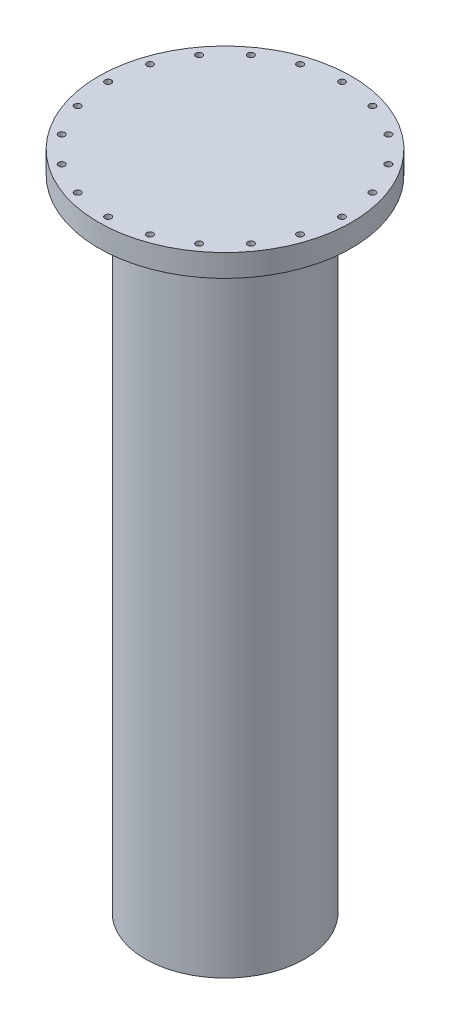
ISO-10303-21;
HEADER;
FILE_DESCRIPTION(('STEP AP214'),'2;1');
FILE_NAME('part.step','',(''),(''),'','','');
FILE_SCHEMA(('AUTOMOTIVE_DESIGN { 1 0 10303 214 1 1 1 1 }'));
ENDSEC;
DATA;
#1=APPLICATION_CONTEXT('core data for automotive mechanical design processes');
#2=APPLICATION_PROTOCOL_DEFINITION('international standard','automotive_design',2000,#1);
#3=PRODUCT_CONTEXT('',#1,'mechanical');
#4=PRODUCT('Part','Part','',(#3));
#5=PRODUCT_RELATED_PRODUCT_CATEGORY('part','',(#4));
#6=PRODUCT_DEFINITION_FORMATION('','',#4);
#7=PRODUCT_DEFINITION_CONTEXT('part definition',#1,'design');
#8=PRODUCT_DEFINITION('design','',#6,#7);
#9=PRODUCT_DEFINITION_SHAPE('','',#8);
#10=(LENGTH_UNIT() NAMED_UNIT(*) SI_UNIT(.MILLI.,.METRE.));
#11=(NAMED_UNIT(*) PLANE_ANGLE_UNIT() SI_UNIT($,.RADIAN.));
#12=(NAMED_UNIT(*) SI_UNIT($,.STERADIAN.) SOLID_ANGLE_UNIT());
#13=UNCERTAINTY_MEASURE_WITH_UNIT(LENGTH_MEASURE(1.E-05),#10,'distance_accuracy_value','');
#14=(GEOMETRIC_REPRESENTATION_CONTEXT(3) GLOBAL_UNCERTAINTY_ASSIGNED_CONTEXT((#13)) GLOBAL_UNIT_ASSIGNED_CONTEXT((#10,
#11,#12)) REPRESENTATION_CONTEXT('',''));
#15=CARTESIAN_POINT('',(0.,0.,0.));
#16=DIRECTION('',(0.,0.,1.));
#17=DIRECTION('',(1.,0.,0.));
#18=AXIS2_PLACEMENT_3D('',#15,#16,#17);
#19=CARTESIAN_POINT('',(0.,-2070.,0.));
#20=DIRECTION('',(0.,-1.,0.));
#21=DIRECTION('',(1.,0.,0.));
#22=AXIS2_PLACEMENT_3D('',#19,#20,#21);
#23=PLANE('',#22);
#24=CARTESIAN_POINT('',(0.,-2070.,0.));
#25=DIRECTION('',(0.,1.,0.));
#26=DIRECTION('',(-1.,0.,0.));
#27=AXIS2_PLACEMENT_3D('',#24,#25,#26);
#28=CIRCLE('',#27,200.);
#29=CARTESIAN_POINT('',(-200.,-2070.,0.));
#30=VERTEX_POINT('',#29);
#31=EDGE_CURVE('E34',#30,#30,#28,.T.);
#32=ORIENTED_EDGE('',*,*,#31,.T.);
#33=EDGE_LOOP('',(#32));
#34=FACE_BOUND('',#33,.T.);
#35=CARTESIAN_POINT('',(0.,-2070.,0.));
#36=DIRECTION('',(0.,1.,0.));
#37=DIRECTION('',(-1.,0.,0.));
#38=AXIS2_PLACEMENT_3D('',#35,#36,#37);
#39=CIRCLE('',#38,250.);
#40=CARTESIAN_POINT('',(-250.,-2070.,0.));
#41=VERTEX_POINT('',#40);
#42=EDGE_CURVE('E52',#41,#41,#39,.T.);
#43=ORIENTED_EDGE('',*,*,#42,.F.);
#44=EDGE_LOOP('',(#43));
#45=FACE_BOUND('',#44,.T.);
#46=ADVANCED_FACE('F30',(#34,#45),#23,.T.);
#47=CARTESIAN_POINT('',(0.,0.,0.));
#48=DIRECTION('',(0.,1.,0.));
#49=DIRECTION('',(-1.,0.,0.));
#50=AXIS2_PLACEMENT_3D('',#47,#48,#49);
#51=CYLINDRICAL_SURFACE('',#50,250.);
#52=CARTESIAN_POINT('',(0.,-70.,0.));
#53=DIRECTION('',(0.,1.,0.));
#54=DIRECTION('',(-1.,0.,0.));
#55=AXIS2_PLACEMENT_3D('',#52,#53,#54);
#56=CIRCLE('',#55,250.);
#57=CARTESIAN_POINT('',(-250.,-70.,0.));
#58=VERTEX_POINT('',#57);
#59=EDGE_CURVE('E54',#58,#58,#56,.T.);
#60=ORIENTED_EDGE('',*,*,#59,.F.);
#61=EDGE_LOOP('',(#60));
#62=FACE_BOUND('',#61,.T.);
#63=ORIENTED_EDGE('',*,*,#42,.T.);
#64=EDGE_LOOP('',(#63));
#65=FACE_BOUND('',#64,.T.);
#66=ADVANCED_FACE('F234',(#62,#65),#51,.T.);
#67=CARTESIAN_POINT('',(250.,-70.,0.));
#68=DIRECTION('',(0.,1.,0.));
#69=DIRECTION('',(-1.,0.,0.));
#70=AXIS2_PLACEMENT_3D('',#67,#68,#69);
#71=PLANE('',#70);
#72=CARTESIAN_POINT('',(296.100219941231,-69.9999999999998,-215.129402339046));
#73=DIRECTION('',(0.,1.,0.));
#74=DIRECTION('',(-0.809016994374947,0.,0.587785252292474));
#75=AXIS2_PLACEMENT_3D('',#72,#73,#74);
#76=CIRCLE('',#75,9.99999999999998);
#77=CARTESIAN_POINT('',(288.010049997481,-69.9999999999998,-209.251549816121));
#78=VERTEX_POINT('',#77);
#79=EDGE_CURVE('E84',#78,#78,#76,.T.);
#80=ORIENTED_EDGE('',*,*,#79,.T.);
#81=EDGE_LOOP('',(#80));
#82=FACE_BOUND('',#81,.T.);
#83=CARTESIAN_POINT('',(215.129402339045,-69.9999999999998,-296.100219941231));
#84=DIRECTION('',(0.,1.,0.));
#85=DIRECTION('',(-0.587785252292471,0.,0.809016994374949));
#86=AXIS2_PLACEMENT_3D('',#83,#84,#85);
#87=CIRCLE('',#86,9.99999999999998);
#88=CARTESIAN_POINT('',(209.25154981612,-69.9999999999998,-288.010049997482));
#89=VERTEX_POINT('',#88);
#90=EDGE_CURVE('E169',#89,#89,#87,.T.);
#91=ORIENTED_EDGE('',*,*,#90,.T.);
#92=EDGE_LOOP('',(#91));
#93=FACE_BOUND('',#92,.T.);
#94=CARTESIAN_POINT('',(113.10021994123,-69.9999999999998,-348.086684964027));
#95=DIRECTION('',(0.,1.,0.));
#96=DIRECTION('',(-0.309016994374945,0.,0.951056516295155));
#97=AXIS2_PLACEMENT_3D('',#94,#95,#96);
#98=CIRCLE('',#97,9.99999999999998);
#99=CARTESIAN_POINT('',(110.01004999748,-69.9999999999998,-338.576119801075));
#100=VERTEX_POINT('',#99);
#101=EDGE_CURVE('E163',#100,#100,#98,.T.);
#102=ORIENTED_EDGE('',*,*,#101,.T.);
#103=EDGE_LOOP('',(#102));
#104=FACE_BOUND('',#103,.T.);
#105=CARTESIAN_POINT('',(-1.27763815131205E-12,-69.9999999999998,-366.));
#106=DIRECTION('',(0.,1.,0.));
#107=DIRECTION('',(0.,0.,1.));
#108=AXIS2_PLACEMENT_3D('',#105,#106,#107);
#109=CIRCLE('',#108,9.99999999999998);
#110=CARTESIAN_POINT('',(-1.24272333792362E-12,-69.9999999999998,-356.));
#111=VERTEX_POINT('',#110);
#112=EDGE_CURVE('E157',#111,#111,#109,.T.);
#113=ORIENTED_EDGE('',*,*,#112,.T.);
#114=EDGE_LOOP('',(#113));
#115=FACE_BOUND('',#114,.T.);
#116=CARTESIAN_POINT('',(-113.100219941232,-69.9999999999998,-348.086684964026));
#117=DIRECTION('',(0.,1.,0.));
#118=DIRECTION('',(0.309016994374952,0.,0.951056516295152));
#119=AXIS2_PLACEMENT_3D('',#116,#117,#118);
#120=CIRCLE('',#119,9.99999999999998);
#121=CARTESIAN_POINT('',(-110.010049997483,-69.9999999999998,-338.576119801074));
#122=VERTEX_POINT('',#121);
#123=EDGE_CURVE('E151',#122,#122,#120,.T.);
#124=ORIENTED_EDGE('',*,*,#123,.T.);
#125=EDGE_LOOP('',(#124));
#126=FACE_BOUND('',#125,.T.);
#127=CARTESIAN_POINT('',(-215.129402339047,-69.9999999999998,-296.10021994123));
#128=DIRECTION('',(0.,1.,0.));
#129=DIRECTION('',(0.587785252292477,0.,0.809016994374945));
#130=AXIS2_PLACEMENT_3D('',#127,#128,#129);
#131=CIRCLE('',#130,9.99999999999998);
#132=CARTESIAN_POINT('',(-209.251549816122,-69.9999999999998,-288.01004999748));
#133=VERTEX_POINT('',#132);
#134=EDGE_CURVE('E145',#133,#133,#131,.T.);
#135=ORIENTED_EDGE('',*,*,#134,.T.);
#136=EDGE_LOOP('',(#135));
#137=FACE_BOUND('',#136,.T.);
#138=CARTESIAN_POINT('',(-296.100219941232,-69.9999999999998,-215.129402339043));
#139=DIRECTION('',(0.,1.,0.));
#140=DIRECTION('',(0.809016994374951,0.,0.587785252292469));
#141=AXIS2_PLACEMENT_3D('',#138,#139,#140);
#142=CIRCLE('',#141,9.99999999999998);
#143=CARTESIAN_POINT('',(-288.010049997482,-69.9999999999998,-209.251549816119));
#144=VERTEX_POINT('',#143);
#145=EDGE_CURVE('E139',#144,#144,#142,.T.);
#146=ORIENTED_EDGE('',*,*,#145,.T.);
#147=EDGE_LOOP('',(#146));
#148=FACE_BOUND('',#147,.T.);
#149=CARTESIAN_POINT('',(-348.086684964027,-69.9999999999998,-113.100219941228));
#150=DIRECTION('',(0.,1.,0.));
#151=DIRECTION('',(0.951056516295156,0.,0.309016994374941));
#152=AXIS2_PLACEMENT_3D('',#149,#150,#151);
#153=CIRCLE('',#152,9.99999999999998);
#154=CARTESIAN_POINT('',(-338.576119801075,-69.9999999999998,-110.010049997479));
#155=VERTEX_POINT('',#154);
#156=EDGE_CURVE('E133',#155,#155,#153,.T.);
#157=ORIENTED_EDGE('',*,*,#156,.T.);
#158=EDGE_LOOP('',(#157));
#159=FACE_BOUND('',#158,.T.);
#160=CARTESIAN_POINT('',(-366.,-69.9999999999998,0.));
#161=DIRECTION('',(0.,1.,0.));
#162=DIRECTION('',(1.,0.,0.));
#163=AXIS2_PLACEMENT_3D('',#160,#161,#162);
#164=CIRCLE('',#163,9.99999999999998);
#165=CARTESIAN_POINT('',(-356.,-69.9999999999998,0.));
#166=VERTEX_POINT('',#165);
#167=EDGE_CURVE('E127',#166,#166,#164,.T.);
#168=ORIENTED_EDGE('',*,*,#167,.T.);
#169=EDGE_LOOP('',(#168));
#170=FACE_BOUND('',#169,.T.);
#171=CARTESIAN_POINT('',(-348.086684964025,-69.9999999999998,113.100219941233));
#172=DIRECTION('',(0.,1.,0.));
#173=DIRECTION('',(0.951056516295151,0.,-0.309016994374955));
#174=AXIS2_PLACEMENT_3D('',#171,#172,#173);
#175=CIRCLE('',#174,9.99999999999998);
#176=CARTESIAN_POINT('',(-338.576119801074,-69.9999999999998,110.010049997484));
#177=VERTEX_POINT('',#176);
#178=EDGE_CURVE('E121',#177,#177,#175,.T.);
#179=ORIENTED_EDGE('',*,*,#178,.T.);
#180=EDGE_LOOP('',(#179));
#181=FACE_BOUND('',#180,.T.);
#182=CARTESIAN_POINT('',(-296.100219941229,-69.9999999999998,215.129402339048));
#183=DIRECTION('',(0.,1.,0.));
#184=DIRECTION('',(0.809016994374942,0.,-0.58778525229248));
#185=AXIS2_PLACEMENT_3D('',#182,#183,#184);
#186=CIRCLE('',#185,9.99999999999998);
#187=CARTESIAN_POINT('',(-288.010049997479,-69.9999999999998,209.251549816123));
#188=VERTEX_POINT('',#187);
#189=EDGE_CURVE('E115',#188,#188,#186,.T.);
#190=ORIENTED_EDGE('',*,*,#189,.T.);
#191=EDGE_LOOP('',(#190));
#192=FACE_BOUND('',#191,.T.);
#193=CARTESIAN_POINT('',(-215.129402339042,-69.9999999999998,296.100219941233));
#194=DIRECTION('',(0.,1.,0.));
#195=DIRECTION('',(0.587785252292465,0.,-0.809016994374953));
#196=AXIS2_PLACEMENT_3D('',#193,#194,#195);
#197=CIRCLE('',#196,9.99999999999998);
#198=CARTESIAN_POINT('',(-209.251549816118,-69.9999999999998,288.010049997483));
#199=VERTEX_POINT('',#198);
#200=EDGE_CURVE('E109',#199,#199,#197,.T.);
#201=ORIENTED_EDGE('',*,*,#200,.T.);
#202=EDGE_LOOP('',(#201));
#203=FACE_BOUND('',#202,.T.);
#204=CARTESIAN_POINT('',(-113.100219941227,-69.9999999999998,348.086684964027));
#205=DIRECTION('',(0.,1.,0.));
#206=DIRECTION('',(0.309016994374938,0.,-0.951056516295157));
#207=AXIS2_PLACEMENT_3D('',#204,#205,#206);
#208=CIRCLE('',#207,9.99999999999998);
#209=CARTESIAN_POINT('',(-110.010049997478,-69.9999999999998,338.576119801076));
#210=VERTEX_POINT('',#209);
#211=EDGE_CURVE('E103',#210,#210,#208,.T.);
#212=ORIENTED_EDGE('',*,*,#211,.T.);
#213=EDGE_LOOP('',(#212));
#214=FACE_BOUND('',#213,.T.);
#215=CARTESIAN_POINT('',(3.8338905287543E-12,-69.9999999999998,366.));
#216=DIRECTION('',(0.,1.,0.));
#217=DIRECTION('',(0.,0.,-1.));
#218=AXIS2_PLACEMENT_3D('',#215,#216,#217);
#219=CIRCLE('',#218,9.99999999999998);
#220=CARTESIAN_POINT('',(3.729146088589E-12,-69.9999999999998,356.));
#221=VERTEX_POINT('',#220);
#222=EDGE_CURVE('E97',#221,#221,#219,.T.);
#223=ORIENTED_EDGE('',*,*,#222,.T.);
#224=EDGE_LOOP('',(#223));
#225=FACE_BOUND('',#224,.T.);
#226=CARTESIAN_POINT('',(113.100219941235,-69.9999999999998,348.086684964025));
#227=DIRECTION('',(0.,1.,0.));
#228=DIRECTION('',(-0.309016994374958,0.,-0.95105651629515));
#229=AXIS2_PLACEMENT_3D('',#226,#227,#228);
#230=CIRCLE('',#229,9.99999999999998);
#231=CARTESIAN_POINT('',(110.010049997485,-69.9999999999998,338.576119801074));
#232=VERTEX_POINT('',#231);
#233=EDGE_CURVE('E91',#232,#232,#230,.T.);
#234=ORIENTED_EDGE('',*,*,#233,.T.);
#235=EDGE_LOOP('',(#234));
#236=FACE_BOUND('',#235,.T.);
#237=CARTESIAN_POINT('',(215.129402339049,-69.9999999999998,296.100219941228));
#238=DIRECTION('',(0.,1.,0.));
#239=DIRECTION('',(-0.587785252292483,0.,-0.80901699437494));
#240=AXIS2_PLACEMENT_3D('',#237,#238,#239);
#241=CIRCLE('',#240,9.99999999999998);
#242=CARTESIAN_POINT('',(209.251549816124,-69.9999999999998,288.010049997479));
#243=VERTEX_POINT('',#242);
#244=EDGE_CURVE('E85',#243,#243,#241,.T.);
#245=ORIENTED_EDGE('',*,*,#244,.T.);
#246=EDGE_LOOP('',(#245));
#247=FACE_BOUND('',#246,.T.);
#248=CARTESIAN_POINT('',(296.100219941234,-69.9999999999998,215.129402339041));
#249=DIRECTION('',(0.,1.,0.));
#250=DIRECTION('',(-0.809016994374955,0.,-0.587785252292462));
#251=AXIS2_PLACEMENT_3D('',#248,#249,#250);
#252=CIRCLE('',#251,9.99999999999998);
#253=CARTESIAN_POINT('',(288.010049997484,-69.9999999999998,209.251549816117));
#254=VERTEX_POINT('',#253);
#255=EDGE_CURVE('E47',#254,#254,#252,.T.);
#256=ORIENTED_EDGE('',*,*,#255,.T.);
#257=EDGE_LOOP('',(#256));
#258=FACE_BOUND('',#257,.T.);
#259=CARTESIAN_POINT('',(348.086684964028,-69.9999999999998,113.100219941226));
#260=DIRECTION('',(0.,1.,0.));
#261=DIRECTION('',(-0.951056516295158,0.,-0.309016994374935));
#262=AXIS2_PLACEMENT_3D('',#259,#260,#261);
#263=CIRCLE('',#262,9.99999999999998);
#264=CARTESIAN_POINT('',(338.576119801076,-69.9999999999998,110.010049997477));
#265=VERTEX_POINT('',#264);
#266=EDGE_CURVE('E38',#265,#265,#263,.T.);
#267=ORIENTED_EDGE('',*,*,#266,.T.);
#268=EDGE_LOOP('',(#267));
#269=FACE_BOUND('',#268,.T.);
#270=CARTESIAN_POINT('',(348.086684964026,-69.9999999999998,-113.100219941231));
#271=DIRECTION('',(0.,1.,0.));
#272=DIRECTION('',(-0.951056516295154,0.,0.309016994374948));
#273=AXIS2_PLACEMENT_3D('',#270,#271,#272);
#274=CIRCLE('',#273,9.99999999999998);
#275=CARTESIAN_POINT('',(338.576119801075,-69.9999999999998,-110.010049997482));
#276=VERTEX_POINT('',#275);
#277=EDGE_CURVE('E78',#276,#276,#274,.T.);
#278=ORIENTED_EDGE('',*,*,#277,.T.);
#279=EDGE_LOOP('',(#278));
#280=FACE_BOUND('',#279,.T.);
#281=CARTESIAN_POINT('',(366.,-69.9999999999998,0.));
#282=DIRECTION('',(0.,1.,0.));
#283=DIRECTION('',(-1.,0.,0.));
#284=AXIS2_PLACEMENT_3D('',#281,#282,#283);
#285=CIRCLE('',#284,9.99999999999998);
#286=CARTESIAN_POINT('',(356.,-69.9999999999998,0.));
#287=VERTEX_POINT('',#286);
#288=EDGE_CURVE('E72',#287,#287,#285,.T.);
#289=ORIENTED_EDGE('',*,*,#288,.T.);
#290=EDGE_LOOP('',(#289));
#291=FACE_BOUND('',#290,.T.);
#292=CARTESIAN_POINT('',(0.,-70.,0.));
#293=DIRECTION('',(0.,1.,0.));
#294=DIRECTION('',(-1.,0.,0.));
#295=AXIS2_PLACEMENT_3D('',#292,#293,#294);
#296=CIRCLE('',#295,396.);
#297=CARTESIAN_POINT('',(-396.,-70.,0.));
#298=VERTEX_POINT('',#297);
#299=EDGE_CURVE('E59',#298,#298,#296,.T.);
#300=ORIENTED_EDGE('',*,*,#299,.F.);
#301=EDGE_LOOP('',(#300));
#302=FACE_BOUND('',#301,.T.);
#303=ORIENTED_EDGE('',*,*,#59,.T.);
#304=EDGE_LOOP('',(#303));
#305=FACE_BOUND('',#304,.T.);
#306=ADVANCED_FACE('F228',(#82,#93,#104,#115,#126,#137,#148,#159,#170,#181,#192,#203,#214,#225,
#236,#247,#258,#269,#280,#291,#302,#305),#71,.F.);
#307=CARTESIAN_POINT('',(0.,0.,0.));
#308=DIRECTION('',(0.,1.,0.));
#309=DIRECTION('',(-1.,0.,0.));
#310=AXIS2_PLACEMENT_3D('',#307,#308,#309);
#311=CYLINDRICAL_SURFACE('',#310,396.);
#312=CARTESIAN_POINT('',(0.,0.,0.));
#313=DIRECTION('',(0.,1.,0.));
#314=DIRECTION('',(-1.,0.,0.));
#315=AXIS2_PLACEMENT_3D('',#312,#313,#314);
#316=CIRCLE('',#315,396.);
#317=CARTESIAN_POINT('',(-396.,0.,0.));
#318=VERTEX_POINT('',#317);
#319=EDGE_CURVE('E69',#318,#318,#316,.T.);
#320=ORIENTED_EDGE('',*,*,#319,.F.);
#321=EDGE_LOOP('',(#320));
#322=FACE_BOUND('',#321,.T.);
#323=ORIENTED_EDGE('',*,*,#299,.T.);
#324=EDGE_LOOP('',(#323));
#325=FACE_BOUND('',#324,.T.);
#326=ADVANCED_FACE('F185',(#322,#325),#311,.T.);
#327=CARTESIAN_POINT('',(0.,0.,0.));
#328=DIRECTION('',(0.,-1.,0.));
#329=DIRECTION('',(1.,0.,0.));
#330=AXIS2_PLACEMENT_3D('',#327,#328,#329);
#331=PLANE('',#330);
#332=CARTESIAN_POINT('',(296.100219941231,0.,-215.129402339046));
#333=DIRECTION('',(0.,1.,0.));
#334=DIRECTION('',(-0.809016994374947,0.,0.587785252292474));
#335=AXIS2_PLACEMENT_3D('',#332,#333,#334);
#336=CIRCLE('',#335,9.99999999999998);
#337=CARTESIAN_POINT('',(288.010049997481,0.,-209.251549816121));
#338=VERTEX_POINT('',#337);
#339=EDGE_CURVE('E172',#338,#338,#336,.T.);
#340=ORIENTED_EDGE('',*,*,#339,.F.);
#341=EDGE_LOOP('',(#340));
#342=FACE_BOUND('',#341,.T.);
#343=CARTESIAN_POINT('',(215.129402339045,0.,-296.100219941231));
#344=DIRECTION('',(0.,1.,0.));
#345=DIRECTION('',(-0.587785252292471,0.,0.809016994374949));
#346=AXIS2_PLACEMENT_3D('',#343,#344,#345);
#347=CIRCLE('',#346,9.99999999999998);
#348=CARTESIAN_POINT('',(209.25154981612,0.,-288.010049997482));
#349=VERTEX_POINT('',#348);
#350=EDGE_CURVE('E166',#349,#349,#347,.T.);
#351=ORIENTED_EDGE('',*,*,#350,.F.);
#352=EDGE_LOOP('',(#351));
#353=FACE_BOUND('',#352,.T.);
#354=CARTESIAN_POINT('',(113.10021994123,0.,-348.086684964027));
#355=DIRECTION('',(0.,1.,0.));
#356=DIRECTION('',(-0.309016994374945,0.,0.951056516295155));
#357=AXIS2_PLACEMENT_3D('',#354,#355,#356);
#358=CIRCLE('',#357,9.99999999999998);
#359=CARTESIAN_POINT('',(110.01004999748,0.,-338.576119801075));
#360=VERTEX_POINT('',#359);
#361=EDGE_CURVE('E160',#360,#360,#358,.T.);
#362=ORIENTED_EDGE('',*,*,#361,.F.);
#363=EDGE_LOOP('',(#362));
#364=FACE_BOUND('',#363,.T.);
#365=CARTESIAN_POINT('',(-1.27788217001659E-12,0.,-366.));
#366=DIRECTION('',(0.,1.,0.));
#367=DIRECTION('',(0.,0.,1.));
#368=AXIS2_PLACEMENT_3D('',#365,#366,#367);
#369=CIRCLE('',#368,9.99999999999998);
#370=CARTESIAN_POINT('',(-1.24296735662816E-12,0.,-356.));
#371=VERTEX_POINT('',#370);
#372=EDGE_CURVE('E154',#371,#371,#369,.T.);
#373=ORIENTED_EDGE('',*,*,#372,.F.);
#374=EDGE_LOOP('',(#373));
#375=FACE_BOUND('',#374,.T.);
#376=CARTESIAN_POINT('',(-113.100219941232,0.,-348.086684964026));
#377=DIRECTION('',(0.,1.,0.));
#378=DIRECTION('',(0.309016994374952,0.,0.951056516295152));
#379=AXIS2_PLACEMENT_3D('',#376,#377,#378);
#380=CIRCLE('',#379,9.99999999999998);
#381=CARTESIAN_POINT('',(-110.010049997483,0.,-338.576119801074));
#382=VERTEX_POINT('',#381);
#383=EDGE_CURVE('E148',#382,#382,#380,.T.);
#384=ORIENTED_EDGE('',*,*,#383,.F.);
#385=EDGE_LOOP('',(#384));
#386=FACE_BOUND('',#385,.T.);
#387=CARTESIAN_POINT('',(-215.129402339047,0.,-296.10021994123));
#388=DIRECTION('',(0.,1.,0.));
#389=DIRECTION('',(0.587785252292477,0.,0.809016994374945));
#390=AXIS2_PLACEMENT_3D('',#387,#388,#389);
#391=CIRCLE('',#390,9.99999999999998);
#392=CARTESIAN_POINT('',(-209.251549816122,0.,-288.01004999748));
#393=VERTEX_POINT('',#392);
#394=EDGE_CURVE('E142',#393,#393,#391,.T.);
#395=ORIENTED_EDGE('',*,*,#394,.F.);
#396=EDGE_LOOP('',(#395));
#397=FACE_BOUND('',#396,.T.);
#398=CARTESIAN_POINT('',(-296.100219941232,0.,-215.129402339043));
#399=DIRECTION('',(0.,1.,0.));
#400=DIRECTION('',(0.809016994374951,0.,0.587785252292469));
#401=AXIS2_PLACEMENT_3D('',#398,#399,#400);
#402=CIRCLE('',#401,9.99999999999998);
#403=CARTESIAN_POINT('',(-288.010049997482,0.,-209.251549816119));
#404=VERTEX_POINT('',#403);
#405=EDGE_CURVE('E136',#404,#404,#402,.T.);
#406=ORIENTED_EDGE('',*,*,#405,.F.);
#407=EDGE_LOOP('',(#406));
#408=FACE_BOUND('',#407,.T.);
#409=CARTESIAN_POINT('',(-348.086684964027,0.,-113.100219941228));
#410=DIRECTION('',(0.,1.,0.));
#411=DIRECTION('',(0.951056516295156,0.,0.309016994374941));
#412=AXIS2_PLACEMENT_3D('',#409,#410,#411);
#413=CIRCLE('',#412,9.99999999999998);
#414=CARTESIAN_POINT('',(-338.576119801075,0.,-110.010049997479));
#415=VERTEX_POINT('',#414);
#416=EDGE_CURVE('E130',#415,#415,#413,.T.);
#417=ORIENTED_EDGE('',*,*,#416,.F.);
#418=EDGE_LOOP('',(#417));
#419=FACE_BOUND('',#418,.T.);
#420=CARTESIAN_POINT('',(-366.,0.,0.));
#421=DIRECTION('',(0.,1.,0.));
#422=DIRECTION('',(1.,0.,0.));
#423=AXIS2_PLACEMENT_3D('',#420,#421,#422);
#424=CIRCLE('',#423,9.99999999999998);
#425=CARTESIAN_POINT('',(-356.,0.,0.));
#426=VERTEX_POINT('',#425);
#427=EDGE_CURVE('E124',#426,#426,#424,.T.);
#428=ORIENTED_EDGE('',*,*,#427,.F.);
#429=EDGE_LOOP('',(#428));
#430=FACE_BOUND('',#429,.T.);
#431=CARTESIAN_POINT('',(-348.086684964025,0.,113.100219941233));
#432=DIRECTION('',(0.,1.,0.));
#433=DIRECTION('',(0.951056516295151,0.,-0.309016994374955));
#434=AXIS2_PLACEMENT_3D('',#431,#432,#433);
#435=CIRCLE('',#434,9.99999999999998);
#436=CARTESIAN_POINT('',(-338.576119801074,0.,110.010049997484));
#437=VERTEX_POINT('',#436);
#438=EDGE_CURVE('E118',#437,#437,#435,.T.);
#439=ORIENTED_EDGE('',*,*,#438,.F.);
#440=EDGE_LOOP('',(#439));
#441=FACE_BOUND('',#440,.T.);
#442=CARTESIAN_POINT('',(-296.100219941229,0.,215.129402339048));
#443=DIRECTION('',(0.,1.,0.));
#444=DIRECTION('',(0.809016994374942,0.,-0.58778525229248));
#445=AXIS2_PLACEMENT_3D('',#442,#443,#444);
#446=CIRCLE('',#445,9.99999999999998);
#447=CARTESIAN_POINT('',(-288.010049997479,0.,209.251549816123));
#448=VERTEX_POINT('',#447);
#449=EDGE_CURVE('E112',#448,#448,#446,.T.);
#450=ORIENTED_EDGE('',*,*,#449,.F.);
#451=EDGE_LOOP('',(#450));
#452=FACE_BOUND('',#451,.T.);
#453=CARTESIAN_POINT('',(-215.129402339042,0.,296.100219941233));
#454=DIRECTION('',(0.,1.,0.));
#455=DIRECTION('',(0.587785252292465,0.,-0.809016994374953));
#456=AXIS2_PLACEMENT_3D('',#453,#454,#455);
#457=CIRCLE('',#456,9.99999999999998);
#458=CARTESIAN_POINT('',(-209.251549816118,0.,288.010049997483));
#459=VERTEX_POINT('',#458);
#460=EDGE_CURVE('E106',#459,#459,#457,.T.);
#461=ORIENTED_EDGE('',*,*,#460,.F.);
#462=EDGE_LOOP('',(#461));
#463=FACE_BOUND('',#462,.T.);
#464=CARTESIAN_POINT('',(-113.100219941227,0.,348.086684964027));
#465=DIRECTION('',(0.,1.,0.));
#466=DIRECTION('',(0.309016994374938,0.,-0.951056516295157));
#467=AXIS2_PLACEMENT_3D('',#464,#465,#466);
#468=CIRCLE('',#467,9.99999999999998);
#469=CARTESIAN_POINT('',(-110.010049997478,0.,338.576119801076));
#470=VERTEX_POINT('',#469);
#471=EDGE_CURVE('E100',#470,#470,#468,.T.);
#472=ORIENTED_EDGE('',*,*,#471,.F.);
#473=EDGE_LOOP('',(#472));
#474=FACE_BOUND('',#473,.T.);
#475=CARTESIAN_POINT('',(3.83364651004976E-12,0.,366.));
#476=DIRECTION('',(0.,1.,0.));
#477=DIRECTION('',(0.,0.,-1.));
#478=AXIS2_PLACEMENT_3D('',#475,#476,#477);
#479=CIRCLE('',#478,9.99999999999998);
#480=CARTESIAN_POINT('',(3.72890206988447E-12,0.,356.));
#481=VERTEX_POINT('',#480);
#482=EDGE_CURVE('E94',#481,#481,#479,.T.);
#483=ORIENTED_EDGE('',*,*,#482,.F.);
#484=EDGE_LOOP('',(#483));
#485=FACE_BOUND('',#484,.T.);
#486=CARTESIAN_POINT('',(113.100219941235,0.,348.086684964025));
#487=DIRECTION('',(0.,1.,0.));
#488=DIRECTION('',(-0.309016994374958,0.,-0.95105651629515));
#489=AXIS2_PLACEMENT_3D('',#486,#487,#488);
#490=CIRCLE('',#489,9.99999999999998);
#491=CARTESIAN_POINT('',(110.010049997485,0.,338.576119801074));
#492=VERTEX_POINT('',#491);
#493=EDGE_CURVE('E88',#492,#492,#490,.T.);
#494=ORIENTED_EDGE('',*,*,#493,.F.);
#495=EDGE_LOOP('',(#494));
#496=FACE_BOUND('',#495,.T.);
#497=CARTESIAN_POINT('',(215.129402339049,0.,296.100219941228));
#498=DIRECTION('',(0.,1.,0.));
#499=DIRECTION('',(-0.587785252292483,0.,-0.80901699437494));
#500=AXIS2_PLACEMENT_3D('',#497,#498,#499);
#501=CIRCLE('',#500,9.99999999999998);
#502=CARTESIAN_POINT('',(209.251549816124,0.,288.010049997479));
#503=VERTEX_POINT('',#502);
#504=EDGE_CURVE('E50',#503,#503,#501,.T.);
#505=ORIENTED_EDGE('',*,*,#504,.F.);
#506=EDGE_LOOP('',(#505));
#507=FACE_BOUND('',#506,.T.);
#508=CARTESIAN_POINT('',(296.100219941234,0.,215.129402339041));
#509=DIRECTION('',(0.,1.,0.));
#510=DIRECTION('',(-0.809016994374955,0.,-0.587785252292462));
#511=AXIS2_PLACEMENT_3D('',#508,#509,#510);
#512=CIRCLE('',#511,9.99999999999998);
#513=CARTESIAN_POINT('',(288.010049997484,0.,209.251549816117));
#514=VERTEX_POINT('',#513);
#515=EDGE_CURVE('E43',#514,#514,#512,.T.);
#516=ORIENTED_EDGE('',*,*,#515,.F.);
#517=EDGE_LOOP('',(#516));
#518=FACE_BOUND('',#517,.T.);
#519=CARTESIAN_POINT('',(348.086684964028,0.,113.100219941226));
#520=DIRECTION('',(0.,1.,0.));
#521=DIRECTION('',(-0.951056516295158,0.,-0.309016994374935));
#522=AXIS2_PLACEMENT_3D('',#519,#520,#521);
#523=CIRCLE('',#522,9.99999999999998);
#524=CARTESIAN_POINT('',(338.576119801076,0.,110.010049997477));
#525=VERTEX_POINT('',#524);
#526=EDGE_CURVE('E10',#525,#525,#523,.T.);
#527=ORIENTED_EDGE('',*,*,#526,.F.);
#528=EDGE_LOOP('',(#527));
#529=FACE_BOUND('',#528,.T.);
#530=CARTESIAN_POINT('',(348.086684964026,0.,-113.100219941231));
#531=DIRECTION('',(0.,1.,0.));
#532=DIRECTION('',(-0.951056516295154,0.,0.309016994374948));
#533=AXIS2_PLACEMENT_3D('',#530,#531,#532);
#534=CIRCLE('',#533,9.99999999999998);
#535=CARTESIAN_POINT('',(338.576119801075,0.,-110.010049997482));
#536=VERTEX_POINT('',#535);
#537=EDGE_CURVE('E81',#536,#536,#534,.T.);
#538=ORIENTED_EDGE('',*,*,#537,.F.);
#539=EDGE_LOOP('',(#538));
#540=FACE_BOUND('',#539,.T.);
#541=CARTESIAN_POINT('',(366.,0.,0.));
#542=DIRECTION('',(0.,1.,0.));
#543=DIRECTION('',(-1.,0.,0.));
#544=AXIS2_PLACEMENT_3D('',#541,#542,#543);
#545=CIRCLE('',#544,9.99999999999998);
#546=CARTESIAN_POINT('',(356.,0.,0.));
#547=VERTEX_POINT('',#546);
#548=EDGE_CURVE('E75',#547,#547,#545,.T.);
#549=ORIENTED_EDGE('',*,*,#548,.F.);
#550=EDGE_LOOP('',(#549));
#551=FACE_BOUND('',#550,.T.);
#552=ORIENTED_EDGE('',*,*,#319,.T.);
#553=EDGE_LOOP('',(#552));
#554=FACE_BOUND('',#553,.T.);
#555=ADVANCED_FACE('F182',(#342,#353,#364,#375,#386,#397,#408,#419,#430,#441,#452,#463,#474,
#485,#496,#507,#518,#529,#540,#551,#554),#331,.F.);
#556=CARTESIAN_POINT('',(366.,-2140.,0.));
#557=DIRECTION('',(0.,1.,0.));
#558=DIRECTION('',(-1.,0.,0.));
#559=AXIS2_PLACEMENT_3D('',#556,#557,#558);
#560=CYLINDRICAL_SURFACE('',#559,9.99999999999998);
#561=ORIENTED_EDGE('',*,*,#548,.T.);
#562=EDGE_LOOP('',(#561));
#563=FACE_BOUND('',#562,.T.);
#564=ORIENTED_EDGE('',*,*,#288,.F.);
#565=EDGE_LOOP('',(#564));
#566=FACE_BOUND('',#565,.T.);
#567=ADVANCED_FACE('F32',(#563,#566),#560,.F.);
#568=CARTESIAN_POINT('',(348.086684964026,-2140.,-113.100219941231));
#569=DIRECTION('',(0.,1.,0.));
#570=DIRECTION('',(-0.951056516295154,0.,0.309016994374948));
#571=AXIS2_PLACEMENT_3D('',#568,#569,#570);
#572=CYLINDRICAL_SURFACE('',#571,9.99999999999998);
#573=ORIENTED_EDGE('',*,*,#537,.T.);
#574=EDGE_LOOP('',(#573));
#575=FACE_BOUND('',#574,.T.);
#576=ORIENTED_EDGE('',*,*,#277,.F.);
#577=EDGE_LOOP('',(#576));
#578=FACE_BOUND('',#577,.T.);
#579=ADVANCED_FACE('F250',(#575,#578),#572,.F.);
#580=CARTESIAN_POINT('',(348.086684964028,-2140.,113.100219941226));
#581=DIRECTION('',(0.,1.,0.));
#582=DIRECTION('',(-0.951056516295158,0.,-0.309016994374935));
#583=AXIS2_PLACEMENT_3D('',#580,#581,#582);
#584=CYLINDRICAL_SURFACE('',#583,9.99999999999998);
#585=ORIENTED_EDGE('',*,*,#526,.T.);
#586=EDGE_LOOP('',(#585));
#587=FACE_BOUND('',#586,.T.);
#588=ORIENTED_EDGE('',*,*,#266,.F.);
#589=EDGE_LOOP('',(#588));
#590=FACE_BOUND('',#589,.T.);
#591=ADVANCED_FACE('F253',(#587,#590),#584,.F.);
#592=CARTESIAN_POINT('',(296.100219941234,-2140.,215.129402339041));
#593=DIRECTION('',(0.,1.,0.));
#594=DIRECTION('',(-0.809016994374955,0.,-0.587785252292462));
#595=AXIS2_PLACEMENT_3D('',#592,#593,#594);
#596=CYLINDRICAL_SURFACE('',#595,9.99999999999998);
#597=ORIENTED_EDGE('',*,*,#515,.T.);
#598=EDGE_LOOP('',(#597));
#599=FACE_BOUND('',#598,.T.);
#600=ORIENTED_EDGE('',*,*,#255,.F.);
#601=EDGE_LOOP('',(#600));
#602=FACE_BOUND('',#601,.T.);
#603=ADVANCED_FACE('F259',(#599,#602),#596,.F.);
#604=CARTESIAN_POINT('',(215.129402339049,-2140.,296.100219941228));
#605=DIRECTION('',(0.,1.,0.));
#606=DIRECTION('',(-0.587785252292483,0.,-0.80901699437494));
#607=AXIS2_PLACEMENT_3D('',#604,#605,#606);
#608=CYLINDRICAL_SURFACE('',#607,9.99999999999998);
#609=ORIENTED_EDGE('',*,*,#504,.T.);
#610=EDGE_LOOP('',(#609));
#611=FACE_BOUND('',#610,.T.);
#612=ORIENTED_EDGE('',*,*,#244,.F.);
#613=EDGE_LOOP('',(#612));
#614=FACE_BOUND('',#613,.T.);
#615=ADVANCED_FACE('F255',(#611,#614),#608,.F.);
#616=CARTESIAN_POINT('',(113.100219941235,-2140.,348.086684964025));
#617=DIRECTION('',(0.,1.,0.));
#618=DIRECTION('',(-0.309016994374958,0.,-0.95105651629515));
#619=AXIS2_PLACEMENT_3D('',#616,#617,#618);
#620=CYLINDRICAL_SURFACE('',#619,9.99999999999998);
#621=ORIENTED_EDGE('',*,*,#493,.T.);
#622=EDGE_LOOP('',(#621));
#623=FACE_BOUND('',#622,.T.);
#624=ORIENTED_EDGE('',*,*,#233,.F.);
#625=EDGE_LOOP('',(#624));
#626=FACE_BOUND('',#625,.T.);
#627=ADVANCED_FACE('F258',(#623,#626),#620,.F.);
#628=CARTESIAN_POINT('',(3.8411065104456E-12,-2140.,366.));
#629=DIRECTION('',(0.,1.,0.));
#630=DIRECTION('',(0.,0.,-1.));
#631=AXIS2_PLACEMENT_3D('',#628,#629,#630);
#632=CYLINDRICAL_SURFACE('',#631,9.99999999999998);
#633=ORIENTED_EDGE('',*,*,#482,.T.);
#634=EDGE_LOOP('',(#633));
#635=FACE_BOUND('',#634,.T.);
#636=ORIENTED_EDGE('',*,*,#222,.F.);
#637=EDGE_LOOP('',(#636));
#638=FACE_BOUND('',#637,.T.);
#639=ADVANCED_FACE('F263',(#635,#638),#632,.F.);
#640=CARTESIAN_POINT('',(-113.100219941227,-2140.,348.086684964027));
#641=DIRECTION('',(0.,1.,0.));
#642=DIRECTION('',(0.309016994374938,0.,-0.951056516295157));
#643=AXIS2_PLACEMENT_3D('',#640,#641,#642);
#644=CYLINDRICAL_SURFACE('',#643,9.99999999999998);
#645=ORIENTED_EDGE('',*,*,#471,.T.);
#646=EDGE_LOOP('',(#645));
#647=FACE_BOUND('',#646,.T.);
#648=ORIENTED_EDGE('',*,*,#211,.F.);
#649=EDGE_LOOP('',(#648));
#650=FACE_BOUND('',#649,.T.);
#651=ADVANCED_FACE('F267',(#647,#650),#644,.F.);
#652=CARTESIAN_POINT('',(-215.129402339042,-2140.,296.100219941233));
#653=DIRECTION('',(0.,1.,0.));
#654=DIRECTION('',(0.587785252292465,0.,-0.809016994374953));
#655=AXIS2_PLACEMENT_3D('',#652,#653,#654);
#656=CYLINDRICAL_SURFACE('',#655,9.99999999999998);
#657=ORIENTED_EDGE('',*,*,#460,.T.);
#658=EDGE_LOOP('',(#657));
#659=FACE_BOUND('',#658,.T.);
#660=ORIENTED_EDGE('',*,*,#200,.F.);
#661=EDGE_LOOP('',(#660));
#662=FACE_BOUND('',#661,.T.);
#663=ADVANCED_FACE('F271',(#659,#662),#656,.F.);
#664=CARTESIAN_POINT('',(-296.100219941229,-2140.,215.129402339048));
#665=DIRECTION('',(0.,1.,0.));
#666=DIRECTION('',(0.809016994374942,0.,-0.58778525229248));
#667=AXIS2_PLACEMENT_3D('',#664,#665,#666);
#668=CYLINDRICAL_SURFACE('',#667,9.99999999999998);
#669=ORIENTED_EDGE('',*,*,#449,.T.);
#670=EDGE_LOOP('',(#669));
#671=FACE_BOUND('',#670,.T.);
#672=ORIENTED_EDGE('',*,*,#189,.F.);
#673=EDGE_LOOP('',(#672));
#674=FACE_BOUND('',#673,.T.);
#675=ADVANCED_FACE('F275',(#671,#674),#668,.F.);
#676=CARTESIAN_POINT('',(-348.086684964025,-2140.,113.100219941233));
#677=DIRECTION('',(0.,1.,0.));
#678=DIRECTION('',(0.951056516295151,0.,-0.309016994374955));
#679=AXIS2_PLACEMENT_3D('',#676,#677,#678);
#680=CYLINDRICAL_SURFACE('',#679,9.99999999999998);
#681=ORIENTED_EDGE('',*,*,#438,.T.);
#682=EDGE_LOOP('',(#681));
#683=FACE_BOUND('',#682,.T.);
#684=ORIENTED_EDGE('',*,*,#178,.F.);
#685=EDGE_LOOP('',(#684));
#686=FACE_BOUND('',#685,.T.);
#687=ADVANCED_FACE('F279',(#683,#686),#680,.F.);
#688=CARTESIAN_POINT('',(-366.,-2140.,0.));
#689=DIRECTION('',(0.,1.,0.));
#690=DIRECTION('',(1.,0.,0.));
#691=AXIS2_PLACEMENT_3D('',#688,#689,#690);
#692=CYLINDRICAL_SURFACE('',#691,9.99999999999998);
#693=ORIENTED_EDGE('',*,*,#427,.T.);
#694=EDGE_LOOP('',(#693));
#695=FACE_BOUND('',#694,.T.);
#696=ORIENTED_EDGE('',*,*,#167,.F.);
#697=EDGE_LOOP('',(#696));
#698=FACE_BOUND('',#697,.T.);
#699=ADVANCED_FACE('F283',(#695,#698),#692,.F.);
#700=CARTESIAN_POINT('',(-348.086684964027,-2140.,-113.100219941228));
#701=DIRECTION('',(0.,1.,0.));
#702=DIRECTION('',(0.951056516295156,0.,0.309016994374941));
#703=AXIS2_PLACEMENT_3D('',#700,#701,#702);
#704=CYLINDRICAL_SURFACE('',#703,9.99999999999998);
#705=ORIENTED_EDGE('',*,*,#416,.T.);
#706=EDGE_LOOP('',(#705));
#707=FACE_BOUND('',#706,.T.);
#708=ORIENTED_EDGE('',*,*,#156,.F.);
#709=EDGE_LOOP('',(#708));
#710=FACE_BOUND('',#709,.T.);
#711=ADVANCED_FACE('F287',(#707,#710),#704,.F.);
#712=CARTESIAN_POINT('',(-296.100219941232,-2140.,-215.129402339043));
#713=DIRECTION('',(0.,1.,0.));
#714=DIRECTION('',(0.809016994374951,0.,0.587785252292469));
#715=AXIS2_PLACEMENT_3D('',#712,#713,#714);
#716=CYLINDRICAL_SURFACE('',#715,9.99999999999998);
#717=ORIENTED_EDGE('',*,*,#405,.T.);
#718=EDGE_LOOP('',(#717));
#719=FACE_BOUND('',#718,.T.);
#720=ORIENTED_EDGE('',*,*,#145,.F.);
#721=EDGE_LOOP('',(#720));
#722=FACE_BOUND('',#721,.T.);
#723=ADVANCED_FACE('F291',(#719,#722),#716,.F.);
#724=CARTESIAN_POINT('',(-215.129402339047,-2140.,-296.10021994123));
#725=DIRECTION('',(0.,1.,0.));
#726=DIRECTION('',(0.587785252292477,0.,0.809016994374945));
#727=AXIS2_PLACEMENT_3D('',#724,#725,#726);
#728=CYLINDRICAL_SURFACE('',#727,9.99999999999998);
#729=ORIENTED_EDGE('',*,*,#394,.T.);
#730=EDGE_LOOP('',(#729));
#731=FACE_BOUND('',#730,.T.);
#732=ORIENTED_EDGE('',*,*,#134,.F.);
#733=EDGE_LOOP('',(#732));
#734=FACE_BOUND('',#733,.T.);
#735=ADVANCED_FACE('F295',(#731,#734),#728,.F.);
#736=CARTESIAN_POINT('',(-113.100219941232,-2140.,-348.086684964026));
#737=DIRECTION('',(0.,1.,0.));
#738=DIRECTION('',(0.309016994374952,0.,0.951056516295152));
#739=AXIS2_PLACEMENT_3D('',#736,#737,#738);
#740=CYLINDRICAL_SURFACE('',#739,9.99999999999998);
#741=ORIENTED_EDGE('',*,*,#383,.T.);
#742=EDGE_LOOP('',(#741));
#743=FACE_BOUND('',#742,.T.);
#744=ORIENTED_EDGE('',*,*,#123,.F.);
#745=EDGE_LOOP('',(#744));
#746=FACE_BOUND('',#745,.T.);
#747=ADVANCED_FACE('F299',(#743,#746),#740,.F.);
#748=CARTESIAN_POINT('',(-1.27042216962075E-12,-2140.,-366.));
#749=DIRECTION('',(0.,1.,0.));
#750=DIRECTION('',(0.,0.,1.));
#751=AXIS2_PLACEMENT_3D('',#748,#749,#750);
#752=CYLINDRICAL_SURFACE('',#751,9.99999999999998);
#753=ORIENTED_EDGE('',*,*,#372,.T.);
#754=EDGE_LOOP('',(#753));
#755=FACE_BOUND('',#754,.T.);
#756=ORIENTED_EDGE('',*,*,#112,.F.);
#757=EDGE_LOOP('',(#756));
#758=FACE_BOUND('',#757,.T.);
#759=ADVANCED_FACE('F303',(#755,#758),#752,.F.);
#760=CARTESIAN_POINT('',(113.10021994123,-2140.,-348.086684964027));
#761=DIRECTION('',(0.,1.,0.));
#762=DIRECTION('',(-0.309016994374945,0.,0.951056516295155));
#763=AXIS2_PLACEMENT_3D('',#760,#761,#762);
#764=CYLINDRICAL_SURFACE('',#763,9.99999999999998);
#765=ORIENTED_EDGE('',*,*,#361,.T.);
#766=EDGE_LOOP('',(#765));
#767=FACE_BOUND('',#766,.T.);
#768=ORIENTED_EDGE('',*,*,#101,.F.);
#769=EDGE_LOOP('',(#768));
#770=FACE_BOUND('',#769,.T.);
#771=ADVANCED_FACE('F307',(#767,#770),#764,.F.);
#772=CARTESIAN_POINT('',(215.129402339045,-2140.,-296.100219941231));
#773=DIRECTION('',(0.,1.,0.));
#774=DIRECTION('',(-0.587785252292471,0.,0.809016994374949));
#775=AXIS2_PLACEMENT_3D('',#772,#773,#774);
#776=CYLINDRICAL_SURFACE('',#775,9.99999999999998);
#777=ORIENTED_EDGE('',*,*,#350,.T.);
#778=EDGE_LOOP('',(#777));
#779=FACE_BOUND('',#778,.T.);
#780=ORIENTED_EDGE('',*,*,#90,.F.);
#781=EDGE_LOOP('',(#780));
#782=FACE_BOUND('',#781,.T.);
#783=ADVANCED_FACE('F311',(#779,#782),#776,.F.);
#784=CARTESIAN_POINT('',(296.100219941231,-2140.,-215.129402339046));
#785=DIRECTION('',(0.,1.,0.));
#786=DIRECTION('',(-0.809016994374947,0.,0.587785252292474));
#787=AXIS2_PLACEMENT_3D('',#784,#785,#786);
#788=CYLINDRICAL_SURFACE('',#787,9.99999999999998);
#789=ORIENTED_EDGE('',*,*,#339,.T.);
#790=EDGE_LOOP('',(#789));
#791=FACE_BOUND('',#790,.T.);
#792=ORIENTED_EDGE('',*,*,#79,.F.);
#793=EDGE_LOOP('',(#792));
#794=FACE_BOUND('',#793,.T.);
#795=ADVANCED_FACE('F179',(#791,#794),#788,.F.);
#796=CARTESIAN_POINT('',(0.,-70.,0.));
#797=DIRECTION('',(0.,1.,0.));
#798=DIRECTION('',(-1.,0.,0.));
#799=AXIS2_PLACEMENT_3D('',#796,#797,#798);
#800=PLANE('',#799);
#801=CARTESIAN_POINT('',(0.,-70.,0.));
#802=DIRECTION('',(0.,1.,0.));
#803=DIRECTION('',(-1.,0.,0.));
#804=AXIS2_PLACEMENT_3D('',#801,#802,#803);
#805=CIRCLE('',#804,200.);
#806=CARTESIAN_POINT('',(-200.,-70.,0.));
#807=VERTEX_POINT('',#806);
#808=EDGE_CURVE('E55',#807,#807,#805,.T.);
#809=ORIENTED_EDGE('',*,*,#808,.F.);
#810=EDGE_LOOP('',(#809));
#811=FACE_BOUND('',#810,.T.);
#812=ADVANCED_FACE('F318',(#811),#800,.F.);
#813=CARTESIAN_POINT('',(0.,0.,0.));
#814=DIRECTION('',(0.,1.,0.));
#815=DIRECTION('',(-1.,0.,0.));
#816=AXIS2_PLACEMENT_3D('',#813,#814,#815);
#817=CYLINDRICAL_SURFACE('',#816,200.);
#818=ORIENTED_EDGE('',*,*,#31,.F.);
#819=EDGE_LOOP('',(#818));
#820=FACE_BOUND('',#819,.T.);
#821=ORIENTED_EDGE('',*,*,#808,.T.);
#822=EDGE_LOOP('',(#821));
#823=FACE_BOUND('',#822,.T.);
#824=ADVANCED_FACE('F246',(#820,#823),#817,.F.);
#825=CLOSED_SHELL('',(#46,#66,#306,#326,#555,#567,#579,#591,#603,#615,#627,#639,#651,#663,#675,
#687,#699,#711,#723,#735,#747,#759,#771,#783,#795,#812,#824));
#826=MANIFOLD_SOLID_BREP('B2',#825);
#827=ADVANCED_BREP_SHAPE_REPRESENTATION('',(#18,#826),#14);
#828=SHAPE_DEFINITION_REPRESENTATION(#9,#827);
ENDSEC;
END-ISO-10303-21;
